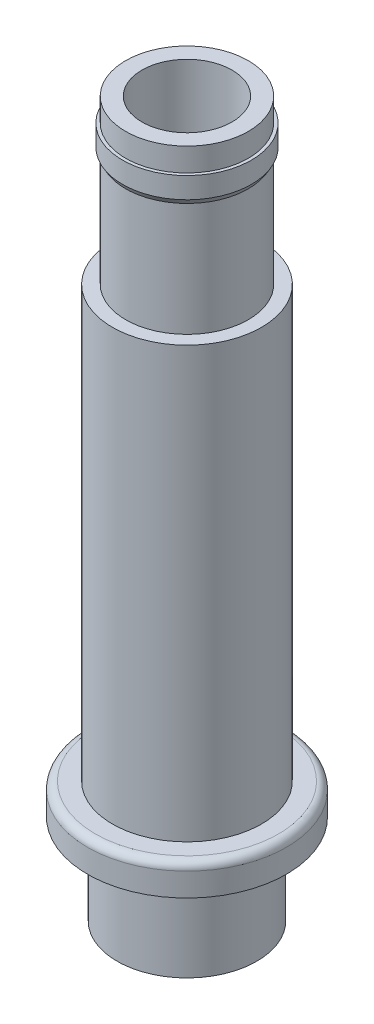
ISO-10303-21;
HEADER;
FILE_DESCRIPTION(('STEP AP214'),'2;1');
FILE_NAME('part.step','',(''),(''),'','','');
FILE_SCHEMA(('AUTOMOTIVE_DESIGN { 1 0 10303 214 1 1 1 1 }'));
ENDSEC;
DATA;
#1=APPLICATION_CONTEXT('core data for automotive mechanical design processes');
#2=APPLICATION_PROTOCOL_DEFINITION('international standard','automotive_design',2000,#1);
#3=PRODUCT_CONTEXT('',#1,'mechanical');
#4=PRODUCT('Part','Part','',(#3));
#5=PRODUCT_RELATED_PRODUCT_CATEGORY('part','',(#4));
#6=PRODUCT_DEFINITION_FORMATION('','',#4);
#7=PRODUCT_DEFINITION_CONTEXT('part definition',#1,'design');
#8=PRODUCT_DEFINITION('design','',#6,#7);
#9=PRODUCT_DEFINITION_SHAPE('','',#8);
#10=(LENGTH_UNIT() NAMED_UNIT(*) SI_UNIT(.MILLI.,.METRE.));
#11=(NAMED_UNIT(*) PLANE_ANGLE_UNIT() SI_UNIT($,.RADIAN.));
#12=(NAMED_UNIT(*) SI_UNIT($,.STERADIAN.) SOLID_ANGLE_UNIT());
#13=UNCERTAINTY_MEASURE_WITH_UNIT(LENGTH_MEASURE(1.E-05),#10,'distance_accuracy_value','');
#14=(GEOMETRIC_REPRESENTATION_CONTEXT(3) GLOBAL_UNCERTAINTY_ASSIGNED_CONTEXT((#13)) GLOBAL_UNIT_ASSIGNED_CONTEXT((#10,
#11,#12)) REPRESENTATION_CONTEXT('',''));
#15=CARTESIAN_POINT('',(0.,0.,0.));
#16=DIRECTION('',(0.,0.,1.));
#17=DIRECTION('',(1.,0.,0.));
#18=AXIS2_PLACEMENT_3D('',#15,#16,#17);
#19=CARTESIAN_POINT('',(0.,0.,0.));
#20=DIRECTION('',(0.,-1.,0.));
#21=DIRECTION('',(0.,0.,-1.));
#22=AXIS2_PLACEMENT_3D('',#19,#20,#21);
#23=CYLINDRICAL_SURFACE('',#22,3.15);
#24=CARTESIAN_POINT('',(0.,6.8,0.));
#25=DIRECTION('',(0.,-1.,0.));
#26=DIRECTION('',(0.,0.,-1.));
#27=AXIS2_PLACEMENT_3D('',#24,#25,#26);
#28=CIRCLE('',#27,3.15);
#29=CARTESIAN_POINT('',(0.,6.8,-3.15));
#30=VERTEX_POINT('',#29);
#31=EDGE_CURVE('E185',#30,#30,#28,.T.);
#32=ORIENTED_EDGE('',*,*,#31,.T.);
#33=EDGE_LOOP('',(#32));
#34=FACE_BOUND('',#33,.T.);
#35=CARTESIAN_POINT('',(0.,33.,0.));
#36=DIRECTION('',(0.,-1.,0.));
#37=DIRECTION('',(0.,0.,-1.));
#38=AXIS2_PLACEMENT_3D('',#35,#36,#37);
#39=CIRCLE('',#38,3.15);
#40=CARTESIAN_POINT('',(3.1304951684997,33.,0.350000000000033));
#41=VERTEX_POINT('',#40);
#42=CARTESIAN_POINT('',(0.35,33.,3.13049516849971));
#43=VERTEX_POINT('',#42);
#44=EDGE_CURVE('E166',#41,#43,#39,.T.);
#45=ORIENTED_EDGE('',*,*,#44,.F.);
#46=DIRECTION('',(0.,-1.,0.));
#47=VECTOR('',#46,1.);
#48=CARTESIAN_POINT('',(3.1304951684997,0.,0.350000000000033));
#49=LINE('',#48,#47);
#50=CARTESIAN_POINT('',(3.1304951684997,14.,0.350000000000033));
#51=VERTEX_POINT('',#50);
#52=EDGE_CURVE('E150',#51,#41,#49,.F.);
#53=ORIENTED_EDGE('',*,*,#52,.F.);
#54=CARTESIAN_POINT('',(0.,14.,0.));
#55=DIRECTION('',(0.,1.,0.));
#56=DIRECTION('',(0.,0.,1.));
#57=AXIS2_PLACEMENT_3D('',#54,#55,#56);
#58=CIRCLE('',#57,3.15);
#59=CARTESIAN_POINT('',(3.13049516849971,14.,-0.349999999999967));
#60=VERTEX_POINT('',#59);
#61=EDGE_CURVE('E160',#60,#51,#58,.F.);
#62=ORIENTED_EDGE('',*,*,#61,.F.);
#63=DIRECTION('',(0.,-1.,0.));
#64=VECTOR('',#63,1.);
#65=CARTESIAN_POINT('',(3.13049516849971,0.,-0.349999999999967));
#66=LINE('',#65,#64);
#67=CARTESIAN_POINT('',(3.13049516849971,33.,-0.349999999999967));
#68=VERTEX_POINT('',#67);
#69=EDGE_CURVE('E775',#68,#60,#66,.T.);
#70=ORIENTED_EDGE('',*,*,#69,.F.);
#71=CARTESIAN_POINT('',(0.35,33.,-3.13049516849971));
#72=VERTEX_POINT('',#71);
#73=EDGE_CURVE('E174',#72,#68,#39,.T.);
#74=ORIENTED_EDGE('',*,*,#73,.F.);
#75=DIRECTION('',(0.,-1.,0.));
#76=VECTOR('',#75,1.);
#77=CARTESIAN_POINT('',(0.35,0.,-3.13049516849971));
#78=LINE('',#77,#76);
#79=CARTESIAN_POINT('',(0.35,14.,-3.13049516849971));
#80=VERTEX_POINT('',#79);
#81=EDGE_CURVE('E215',#80,#72,#78,.F.);
#82=ORIENTED_EDGE('',*,*,#81,.F.);
#83=CARTESIAN_POINT('',(0.,14.,0.));
#84=DIRECTION('',(0.,1.,0.));
#85=DIRECTION('',(0.,0.,1.));
#86=AXIS2_PLACEMENT_3D('',#83,#84,#85);
#87=CIRCLE('',#86,3.15);
#88=CARTESIAN_POINT('',(-0.35,14.,-3.13049516849971));
#89=VERTEX_POINT('',#88);
#90=EDGE_CURVE('E205',#89,#80,#87,.F.);
#91=ORIENTED_EDGE('',*,*,#90,.F.);
#92=DIRECTION('',(0.,-1.,0.));
#93=VECTOR('',#92,1.);
#94=CARTESIAN_POINT('',(-0.35,0.,-3.13049516849971));
#95=LINE('',#94,#93);
#96=CARTESIAN_POINT('',(-0.35,33.,-3.13049516849971));
#97=VERTEX_POINT('',#96);
#98=EDGE_CURVE('E203',#97,#89,#95,.T.);
#99=ORIENTED_EDGE('',*,*,#98,.F.);
#100=CARTESIAN_POINT('',(-3.1304951684997,33.,-0.350000000000011));
#101=VERTEX_POINT('',#100);
#102=EDGE_CURVE('E179',#101,#97,#39,.T.);
#103=ORIENTED_EDGE('',*,*,#102,.F.);
#104=DIRECTION('',(0.,-1.,0.));
#105=VECTOR('',#104,1.);
#106=CARTESIAN_POINT('',(-3.1304951684997,0.,-0.350000000000011));
#107=LINE('',#106,#105);
#108=CARTESIAN_POINT('',(-3.1304951684997,14.,-0.350000000000011));
#109=VERTEX_POINT('',#108);
#110=EDGE_CURVE('E201',#109,#101,#107,.F.);
#111=ORIENTED_EDGE('',*,*,#110,.F.);
#112=CARTESIAN_POINT('',(0.,14.,0.));
#113=DIRECTION('',(0.,1.,0.));
#114=DIRECTION('',(0.,0.,1.));
#115=AXIS2_PLACEMENT_3D('',#112,#113,#114);
#116=CIRCLE('',#115,3.15);
#117=CARTESIAN_POINT('',(-3.13049516849971,14.,0.349999999999989));
#118=VERTEX_POINT('',#117);
#119=EDGE_CURVE('E238',#118,#109,#116,.F.);
#120=ORIENTED_EDGE('',*,*,#119,.F.);
#121=DIRECTION('',(0.,-1.,0.));
#122=VECTOR('',#121,1.);
#123=CARTESIAN_POINT('',(-3.13049516849971,0.,0.349999999999989));
#124=LINE('',#123,#122);
#125=CARTESIAN_POINT('',(-3.13049516849971,33.,0.349999999999989));
#126=VERTEX_POINT('',#125);
#127=EDGE_CURVE('E231',#126,#118,#124,.T.);
#128=ORIENTED_EDGE('',*,*,#127,.F.);
#129=CARTESIAN_POINT('',(-0.35,33.,3.13049516849971));
#130=VERTEX_POINT('',#129);
#131=EDGE_CURVE('E177',#130,#126,#39,.T.);
#132=ORIENTED_EDGE('',*,*,#131,.F.);
#133=DIRECTION('',(0.,-1.,0.));
#134=VECTOR('',#133,1.);
#135=CARTESIAN_POINT('',(-0.35,0.,3.13049516849971));
#136=LINE('',#135,#134);
#137=CARTESIAN_POINT('',(-0.35,14.,3.13049516849971));
#138=VERTEX_POINT('',#137);
#139=EDGE_CURVE('E259',#138,#130,#136,.F.);
#140=ORIENTED_EDGE('',*,*,#139,.F.);
#141=CARTESIAN_POINT('',(0.,14.,0.));
#142=DIRECTION('',(0.,1.,0.));
#143=DIRECTION('',(0.,0.,1.));
#144=AXIS2_PLACEMENT_3D('',#141,#142,#143);
#145=CIRCLE('',#144,3.15);
#146=CARTESIAN_POINT('',(0.35,14.,3.13049516849971));
#147=VERTEX_POINT('',#146);
#148=EDGE_CURVE('E262',#147,#138,#145,.F.);
#149=ORIENTED_EDGE('',*,*,#148,.F.);
#150=DIRECTION('',(0.,-1.,0.));
#151=VECTOR('',#150,1.);
#152=CARTESIAN_POINT('',(0.35,0.,3.13049516849971));
#153=LINE('',#152,#151);
#154=EDGE_CURVE('E173',#43,#147,#153,.T.);
#155=ORIENTED_EDGE('',*,*,#154,.F.);
#156=EDGE_LOOP('',(#45,#53,#62,#70,#74,#82,#91,#99,#103,#111,#120,#128,#132,#140,#149,#155));
#157=FACE_BOUND('',#156,.T.);
#158=ADVANCED_FACE('F37',(#34,#157),#23,.F.);
#159=CARTESIAN_POINT('',(0.,33.,-1.75));
#160=DIRECTION('',(0.,-1.,0.));
#161=DIRECTION('',(0.,0.,-1.));
#162=AXIS2_PLACEMENT_3D('',#159,#160,#161);
#163=PLANE('',#162);
#164=CARTESIAN_POINT('',(0.,33.,0.));
#165=DIRECTION('',(0.,-1.,0.));
#166=DIRECTION('',(0.,0.,-1.));
#167=AXIS2_PLACEMENT_3D('',#164,#165,#166);
#168=CIRCLE('',#167,1.75);
#169=CARTESIAN_POINT('',(0.,33.,-1.75));
#170=VERTEX_POINT('',#169);
#171=EDGE_CURVE('E175',#170,#170,#168,.T.);
#172=ORIENTED_EDGE('',*,*,#171,.F.);
#173=EDGE_LOOP('',(#172));
#174=FACE_BOUND('',#173,.T.);
#175=DIRECTION('',(0.,0.,-1.));
#176=VECTOR('',#175,1.);
#177=CARTESIAN_POINT('',(2.15,33.,-0.349999999999977));
#178=LINE('',#177,#176);
#179=CARTESIAN_POINT('',(2.15,33.,0.350000000000023));
#180=VERTEX_POINT('',#179);
#181=CARTESIAN_POINT('',(2.15,33.,-0.349999999999977));
#182=VERTEX_POINT('',#181);
#183=EDGE_CURVE('E169',#180,#182,#178,.T.);
#184=ORIENTED_EDGE('',*,*,#183,.F.);
#185=DIRECTION('',(-1.,0.,0.));
#186=VECTOR('',#185,1.);
#187=CARTESIAN_POINT('',(3.15,33.,0.350000000000033));
#188=LINE('',#187,#186);
#189=EDGE_CURVE('E153',#41,#180,#188,.T.);
#190=ORIENTED_EDGE('',*,*,#189,.F.);
#191=ORIENTED_EDGE('',*,*,#44,.T.);
#192=DIRECTION('',(0.,0.,1.));
#193=VECTOR('',#192,1.);
#194=CARTESIAN_POINT('',(0.35,33.,3.15));
#195=LINE('',#194,#193);
#196=CARTESIAN_POINT('',(0.35,33.,2.15));
#197=VERTEX_POINT('',#196);
#198=EDGE_CURVE('E253',#197,#43,#195,.T.);
#199=ORIENTED_EDGE('',*,*,#198,.F.);
#200=DIRECTION('',(1.,0.,0.));
#201=VECTOR('',#200,1.);
#202=CARTESIAN_POINT('',(0.35,33.,2.15));
#203=LINE('',#202,#201);
#204=CARTESIAN_POINT('',(-0.35,33.,2.15));
#205=VERTEX_POINT('',#204);
#206=EDGE_CURVE('E255',#205,#197,#203,.T.);
#207=ORIENTED_EDGE('',*,*,#206,.F.);
#208=DIRECTION('',(0.,0.,-1.));
#209=VECTOR('',#208,1.);
#210=CARTESIAN_POINT('',(-0.35,33.,3.15));
#211=LINE('',#210,#209);
#212=EDGE_CURVE('E257',#130,#205,#211,.T.);
#213=ORIENTED_EDGE('',*,*,#212,.F.);
#214=ORIENTED_EDGE('',*,*,#131,.T.);
#215=DIRECTION('',(-1.,0.,0.));
#216=VECTOR('',#215,1.);
#217=CARTESIAN_POINT('',(-3.15,33.,0.349999999999989));
#218=LINE('',#217,#216);
#219=CARTESIAN_POINT('',(-2.15,33.,0.349999999999992));
#220=VERTEX_POINT('',#219);
#221=EDGE_CURVE('E229',#220,#126,#218,.T.);
#222=ORIENTED_EDGE('',*,*,#221,.F.);
#223=DIRECTION('',(0.,0.,1.));
#224=VECTOR('',#223,1.);
#225=CARTESIAN_POINT('',(-2.15,33.,0.349999999999993));
#226=LINE('',#225,#224);
#227=CARTESIAN_POINT('',(-2.15,33.,-0.350000000000007));
#228=VERTEX_POINT('',#227);
#229=EDGE_CURVE('E232',#228,#220,#226,.T.);
#230=ORIENTED_EDGE('',*,*,#229,.F.);
#231=DIRECTION('',(1.,0.,0.));
#232=VECTOR('',#231,1.);
#233=CARTESIAN_POINT('',(-3.15,33.,-0.350000000000011));
#234=LINE('',#233,#232);
#235=EDGE_CURVE('E197',#101,#228,#234,.T.);
#236=ORIENTED_EDGE('',*,*,#235,.F.);
#237=ORIENTED_EDGE('',*,*,#102,.T.);
#238=DIRECTION('',(0.,0.,-1.));
#239=VECTOR('',#238,1.);
#240=CARTESIAN_POINT('',(-0.35,33.,-3.15));
#241=LINE('',#240,#239);
#242=CARTESIAN_POINT('',(-0.35,33.,-2.15));
#243=VERTEX_POINT('',#242);
#244=EDGE_CURVE('E195',#243,#97,#241,.T.);
#245=ORIENTED_EDGE('',*,*,#244,.F.);
#246=DIRECTION('',(-1.,0.,0.));
#247=VECTOR('',#246,1.);
#248=CARTESIAN_POINT('',(-0.35,33.,-2.15));
#249=LINE('',#248,#247);
#250=CARTESIAN_POINT('',(0.35,33.,-2.15));
#251=VERTEX_POINT('',#250);
#252=EDGE_CURVE('E207',#251,#243,#249,.T.);
#253=ORIENTED_EDGE('',*,*,#252,.F.);
#254=DIRECTION('',(0.,0.,1.));
#255=VECTOR('',#254,1.);
#256=CARTESIAN_POINT('',(0.35,33.,-3.15));
#257=LINE('',#256,#255);
#258=EDGE_CURVE('E209',#72,#251,#257,.T.);
#259=ORIENTED_EDGE('',*,*,#258,.F.);
#260=ORIENTED_EDGE('',*,*,#73,.T.);
#261=DIRECTION('',(1.,0.,0.));
#262=VECTOR('',#261,1.);
#263=CARTESIAN_POINT('',(3.15,33.,-0.349999999999967));
#264=LINE('',#263,#262);
#265=EDGE_CURVE('E784',#182,#68,#264,.T.);
#266=ORIENTED_EDGE('',*,*,#265,.F.);
#267=EDGE_LOOP('',(#184,#190,#191,#199,#207,#213,#214,#222,#230,#236,#237,#245,#253,#259,#260,#266));
#268=FACE_BOUND('',#267,.T.);
#269=ADVANCED_FACE('F164',(#174,#268),#163,.T.);
#270=CARTESIAN_POINT('',(0.,6.8,-3.15));
#271=DIRECTION('',(0.,-1.,0.));
#272=DIRECTION('',(0.,0.,-1.));
#273=AXIS2_PLACEMENT_3D('',#270,#271,#272);
#274=PLANE('',#273);
#275=CARTESIAN_POINT('',(0.,6.8,0.));
#276=DIRECTION('',(0.,-1.,0.));
#277=DIRECTION('',(0.,0.,-1.));
#278=AXIS2_PLACEMENT_3D('',#275,#276,#277);
#279=CIRCLE('',#278,3.5);
#280=CARTESIAN_POINT('',(0.,6.8,-3.5));
#281=VERTEX_POINT('',#280);
#282=EDGE_CURVE('E277',#281,#281,#279,.T.);
#283=ORIENTED_EDGE('',*,*,#282,.T.);
#284=EDGE_LOOP('',(#283));
#285=FACE_BOUND('',#284,.T.);
#286=ORIENTED_EDGE('',*,*,#31,.F.);
#287=EDGE_LOOP('',(#286));
#288=FACE_BOUND('',#287,.T.);
#289=ADVANCED_FACE('F336',(#285,#288),#274,.T.);
#290=CARTESIAN_POINT('',(0.,0.,0.));
#291=DIRECTION('',(0.,-1.,0.));
#292=DIRECTION('',(0.,0.,-1.));
#293=AXIS2_PLACEMENT_3D('',#290,#291,#292);
#294=CYLINDRICAL_SURFACE('',#293,1.75);
#295=ORIENTED_EDGE('',*,*,#171,.T.);
#296=EDGE_LOOP('',(#295));
#297=FACE_BOUND('',#296,.T.);
#298=CARTESIAN_POINT('',(0.,34.,0.));
#299=DIRECTION('',(0.,-1.,0.));
#300=DIRECTION('',(0.,0.,-1.));
#301=AXIS2_PLACEMENT_3D('',#298,#299,#300);
#302=CIRCLE('',#301,1.75);
#303=CARTESIAN_POINT('',(0.,34.,-1.75));
#304=VERTEX_POINT('',#303);
#305=EDGE_CURVE('E181',#304,#304,#302,.T.);
#306=ORIENTED_EDGE('',*,*,#305,.F.);
#307=EDGE_LOOP('',(#306));
#308=FACE_BOUND('',#307,.T.);
#309=ADVANCED_FACE('F334',(#297,#308),#294,.F.);
#310=CARTESIAN_POINT('',(0.,37.5,0.));
#311=DIRECTION('',(0.,1.,0.));
#312=DIRECTION('',(0.,0.,1.));
#313=AXIS2_PLACEMENT_3D('',#310,#311,#312);
#314=CONICAL_SURFACE('',#313,2.9,0.317458735254631);
#315=ORIENTED_EDGE('',*,*,#305,.T.);
#316=EDGE_LOOP('',(#315));
#317=FACE_BOUND('',#316,.T.);
#318=CARTESIAN_POINT('',(0.,37.5,0.));
#319=DIRECTION('',(0.,-1.,0.));
#320=DIRECTION('',(0.,0.,-1.));
#321=AXIS2_PLACEMENT_3D('',#318,#319,#320);
#322=CIRCLE('',#321,2.9);
#323=CARTESIAN_POINT('',(0.,37.5,-2.9));
#324=VERTEX_POINT('',#323);
#325=EDGE_CURVE('E325',#324,#324,#322,.T.);
#326=ORIENTED_EDGE('',*,*,#325,.F.);
#327=EDGE_LOOP('',(#326));
#328=FACE_BOUND('',#327,.T.);
#329=ADVANCED_FACE('F331',(#317,#328),#314,.F.);
#330=CARTESIAN_POINT('',(0.,0.,0.));
#331=DIRECTION('',(0.,-1.,0.));
#332=DIRECTION('',(0.,0.,-1.));
#333=AXIS2_PLACEMENT_3D('',#330,#331,#332);
#334=CYLINDRICAL_SURFACE('',#333,2.9);
#335=ORIENTED_EDGE('',*,*,#325,.T.);
#336=EDGE_LOOP('',(#335));
#337=FACE_BOUND('',#336,.T.);
#338=CARTESIAN_POINT('',(0.,46.,0.));
#339=DIRECTION('',(0.,-1.,0.));
#340=DIRECTION('',(0.,0.,-1.));
#341=AXIS2_PLACEMENT_3D('',#338,#339,#340);
#342=CIRCLE('',#341,2.9);
#343=CARTESIAN_POINT('',(0.,46.,-2.9));
#344=VERTEX_POINT('',#343);
#345=EDGE_CURVE('E322',#344,#344,#342,.T.);
#346=ORIENTED_EDGE('',*,*,#345,.F.);
#347=EDGE_LOOP('',(#346));
#348=FACE_BOUND('',#347,.T.);
#349=ADVANCED_FACE('F343',(#337,#348),#334,.F.);
#350=CARTESIAN_POINT('',(0.,46.,-3.95));
#351=DIRECTION('',(0.,1.,0.));
#352=DIRECTION('',(0.,0.,1.));
#353=AXIS2_PLACEMENT_3D('',#350,#351,#352);
#354=PLANE('',#353);
#355=ORIENTED_EDGE('',*,*,#345,.T.);
#356=EDGE_LOOP('',(#355));
#357=FACE_BOUND('',#356,.T.);
#358=CARTESIAN_POINT('',(0.,46.,0.));
#359=DIRECTION('',(0.,-1.,0.));
#360=DIRECTION('',(0.,0.,-1.));
#361=AXIS2_PLACEMENT_3D('',#358,#359,#360);
#362=CIRCLE('',#361,3.95);
#363=CARTESIAN_POINT('',(0.,46.,-3.95));
#364=VERTEX_POINT('',#363);
#365=EDGE_CURVE('E319',#364,#364,#362,.T.);
#366=ORIENTED_EDGE('',*,*,#365,.F.);
#367=EDGE_LOOP('',(#366));
#368=FACE_BOUND('',#367,.T.);
#369=ADVANCED_FACE('F386',(#357,#368),#354,.T.);
#370=CARTESIAN_POINT('',(0.,0.,0.));
#371=DIRECTION('',(0.,-1.,0.));
#372=DIRECTION('',(0.,0.,-1.));
#373=AXIS2_PLACEMENT_3D('',#370,#371,#372);
#374=CYLINDRICAL_SURFACE('',#373,3.95);
#375=ORIENTED_EDGE('',*,*,#365,.T.);
#376=EDGE_LOOP('',(#375));
#377=FACE_BOUND('',#376,.T.);
#378=CARTESIAN_POINT('',(0.,44.5,0.));
#379=DIRECTION('',(0.,-1.,0.));
#380=DIRECTION('',(0.,0.,-1.));
#381=AXIS2_PLACEMENT_3D('',#378,#379,#380);
#382=CIRCLE('',#381,3.95);
#383=CARTESIAN_POINT('',(0.,44.5,-3.95));
#384=VERTEX_POINT('',#383);
#385=EDGE_CURVE('E316',#384,#384,#382,.T.);
#386=ORIENTED_EDGE('',*,*,#385,.F.);
#387=EDGE_LOOP('',(#386));
#388=FACE_BOUND('',#387,.T.);
#389=ADVANCED_FACE('F397',(#377,#388),#374,.T.);
#390=CARTESIAN_POINT('',(0.,44.5,-4.15));
#391=DIRECTION('',(0.,1.,0.));
#392=DIRECTION('',(0.,0.,1.));
#393=AXIS2_PLACEMENT_3D('',#390,#391,#392);
#394=PLANE('',#393);
#395=ORIENTED_EDGE('',*,*,#385,.T.);
#396=EDGE_LOOP('',(#395));
#397=FACE_BOUND('',#396,.T.);
#398=CARTESIAN_POINT('',(0.,44.5,0.));
#399=DIRECTION('',(0.,-1.,0.));
#400=DIRECTION('',(0.,0.,-1.));
#401=AXIS2_PLACEMENT_3D('',#398,#399,#400);
#402=CIRCLE('',#401,4.15);
#403=CARTESIAN_POINT('',(0.,44.5,-4.15));
#404=VERTEX_POINT('',#403);
#405=EDGE_CURVE('E313',#404,#404,#402,.T.);
#406=ORIENTED_EDGE('',*,*,#405,.F.);
#407=EDGE_LOOP('',(#406));
#408=FACE_BOUND('',#407,.T.);
#409=ADVANCED_FACE('F408',(#397,#408),#394,.T.);
#410=CARTESIAN_POINT('',(0.,0.,0.));
#411=DIRECTION('',(0.,-1.,0.));
#412=DIRECTION('',(0.,0.,-1.));
#413=AXIS2_PLACEMENT_3D('',#410,#411,#412);
#414=CYLINDRICAL_SURFACE('',#413,4.15);
#415=ORIENTED_EDGE('',*,*,#405,.T.);
#416=EDGE_LOOP('',(#415));
#417=FACE_BOUND('',#416,.T.);
#418=CARTESIAN_POINT('',(0.,43.1464101615138,0.));
#419=DIRECTION('',(0.,-1.,0.));
#420=DIRECTION('',(0.,0.,-1.));
#421=AXIS2_PLACEMENT_3D('',#418,#419,#420);
#422=CIRCLE('',#421,4.15);
#423=CARTESIAN_POINT('',(0.,43.1464101615138,-4.15));
#424=VERTEX_POINT('',#423);
#425=EDGE_CURVE('E310',#424,#424,#422,.T.);
#426=ORIENTED_EDGE('',*,*,#425,.F.);
#427=EDGE_LOOP('',(#426));
#428=FACE_BOUND('',#427,.T.);
#429=ADVANCED_FACE('F419',(#417,#428),#414,.T.);
#430=CARTESIAN_POINT('',(0.,42.8,0.));
#431=DIRECTION('',(0.,1.,0.));
#432=DIRECTION('',(0.,0.,1.));
#433=AXIS2_PLACEMENT_3D('',#430,#431,#432);
#434=CONICAL_SURFACE('',#433,3.95,0.523598775598317);
#435=ORIENTED_EDGE('',*,*,#425,.T.);
#436=EDGE_LOOP('',(#435));
#437=FACE_BOUND('',#436,.T.);
#438=CARTESIAN_POINT('',(0.,42.8,0.));
#439=DIRECTION('',(0.,-1.,0.));
#440=DIRECTION('',(0.,0.,-1.));
#441=AXIS2_PLACEMENT_3D('',#438,#439,#440);
#442=CIRCLE('',#441,3.95);
#443=CARTESIAN_POINT('',(0.,42.8,-3.95));
#444=VERTEX_POINT('',#443);
#445=EDGE_CURVE('E307',#444,#444,#442,.T.);
#446=ORIENTED_EDGE('',*,*,#445,.F.);
#447=EDGE_LOOP('',(#446));
#448=FACE_BOUND('',#447,.T.);
#449=ADVANCED_FACE('F430',(#437,#448),#434,.T.);
#450=CARTESIAN_POINT('',(0.,0.,0.));
#451=DIRECTION('',(0.,-1.,0.));
#452=DIRECTION('',(0.,0.,-1.));
#453=AXIS2_PLACEMENT_3D('',#450,#451,#452);
#454=CYLINDRICAL_SURFACE('',#453,3.95);
#455=ORIENTED_EDGE('',*,*,#445,.T.);
#456=EDGE_LOOP('',(#455));
#457=FACE_BOUND('',#456,.T.);
#458=CARTESIAN_POINT('',(0.,35.5,0.));
#459=DIRECTION('',(0.,-1.,0.));
#460=DIRECTION('',(0.,0.,-1.));
#461=AXIS2_PLACEMENT_3D('',#458,#459,#460);
#462=CIRCLE('',#461,3.95);
#463=CARTESIAN_POINT('',(0.,35.5,-3.95));
#464=VERTEX_POINT('',#463);
#465=EDGE_CURVE('E304',#464,#464,#462,.T.);
#466=ORIENTED_EDGE('',*,*,#465,.F.);
#467=EDGE_LOOP('',(#466));
#468=FACE_BOUND('',#467,.T.);
#469=ADVANCED_FACE('F441',(#457,#468),#454,.T.);
#470=CARTESIAN_POINT('',(0.,35.5,-4.8));
#471=DIRECTION('',(0.,1.,0.));
#472=DIRECTION('',(0.,0.,1.));
#473=AXIS2_PLACEMENT_3D('',#470,#471,#472);
#474=PLANE('',#473);
#475=ORIENTED_EDGE('',*,*,#465,.T.);
#476=EDGE_LOOP('',(#475));
#477=FACE_BOUND('',#476,.T.);
#478=CARTESIAN_POINT('',(0.,35.5,0.));
#479=DIRECTION('',(0.,-1.,0.));
#480=DIRECTION('',(0.,0.,-1.));
#481=AXIS2_PLACEMENT_3D('',#478,#479,#480);
#482=CIRCLE('',#481,4.8);
#483=CARTESIAN_POINT('',(0.,35.5,-4.8));
#484=VERTEX_POINT('',#483);
#485=EDGE_CURVE('E301',#484,#484,#482,.T.);
#486=ORIENTED_EDGE('',*,*,#485,.F.);
#487=EDGE_LOOP('',(#486));
#488=FACE_BOUND('',#487,.T.);
#489=ADVANCED_FACE('F452',(#477,#488),#474,.T.);
#490=CARTESIAN_POINT('',(0.,0.,0.));
#491=DIRECTION('',(0.,-1.,0.));
#492=DIRECTION('',(0.,0.,-1.));
#493=AXIS2_PLACEMENT_3D('',#490,#491,#492);
#494=CYLINDRICAL_SURFACE('',#493,4.8);
#495=ORIENTED_EDGE('',*,*,#485,.T.);
#496=EDGE_LOOP('',(#495));
#497=FACE_BOUND('',#496,.T.);
#498=CARTESIAN_POINT('',(0.,7.8,0.));
#499=DIRECTION('',(0.,-1.,0.));
#500=DIRECTION('',(0.,0.,-1.));
#501=AXIS2_PLACEMENT_3D('',#498,#499,#500);
#502=CIRCLE('',#501,4.8);
#503=CARTESIAN_POINT('',(0.,7.8,-4.8));
#504=VERTEX_POINT('',#503);
#505=EDGE_CURVE('E298',#504,#504,#502,.T.);
#506=ORIENTED_EDGE('',*,*,#505,.F.);
#507=EDGE_LOOP('',(#506));
#508=FACE_BOUND('',#507,.T.);
#509=ADVANCED_FACE('F463',(#497,#508),#494,.T.);
#510=CARTESIAN_POINT('',(0.,7.8,-6.4));
#511=DIRECTION('',(0.,1.,0.));
#512=DIRECTION('',(0.,0.,1.));
#513=AXIS2_PLACEMENT_3D('',#510,#511,#512);
#514=PLANE('',#513);
#515=CARTESIAN_POINT('',(0.,7.8,0.));
#516=DIRECTION('',(0.,1.,0.));
#517=DIRECTION('',(0.,0.,1.));
#518=AXIS2_PLACEMENT_3D('',#515,#516,#517);
#519=CIRCLE('',#518,5.9);
#520=CARTESIAN_POINT('',(0.,7.8,5.9));
#521=VERTEX_POINT('',#520);
#522=EDGE_CURVE('E11',#521,#521,#519,.T.);
#523=ORIENTED_EDGE('',*,*,#522,.T.);
#524=EDGE_LOOP('',(#523));
#525=FACE_BOUND('',#524,.T.);
#526=ORIENTED_EDGE('',*,*,#505,.T.);
#527=EDGE_LOOP('',(#526));
#528=FACE_BOUND('',#527,.T.);
#529=ADVANCED_FACE('F474',(#525,#528),#514,.T.);
#530=CARTESIAN_POINT('',(0.,0.,0.));
#531=DIRECTION('',(0.,-1.,0.));
#532=DIRECTION('',(0.,0.,-1.));
#533=AXIS2_PLACEMENT_3D('',#530,#531,#532);
#534=CYLINDRICAL_SURFACE('',#533,6.4);
#535=CARTESIAN_POINT('',(0.,7.3,0.));
#536=DIRECTION('',(0.,1.,0.));
#537=DIRECTION('',(0.,0.,1.));
#538=AXIS2_PLACEMENT_3D('',#535,#536,#537);
#539=CIRCLE('',#538,6.4);
#540=CARTESIAN_POINT('',(0.,7.3,6.4));
#541=VERTEX_POINT('',#540);
#542=EDGE_CURVE('E45',#541,#541,#539,.F.);
#543=ORIENTED_EDGE('',*,*,#542,.T.);
#544=EDGE_LOOP('',(#543));
#545=FACE_BOUND('',#544,.T.);
#546=CARTESIAN_POINT('',(0.,5.8,0.));
#547=DIRECTION('',(0.,-1.,0.));
#548=DIRECTION('',(0.,0.,-1.));
#549=AXIS2_PLACEMENT_3D('',#546,#547,#548);
#550=CIRCLE('',#549,6.4);
#551=CARTESIAN_POINT('',(0.,5.8,-6.4));
#552=VERTEX_POINT('',#551);
#553=EDGE_CURVE('E295',#552,#552,#550,.T.);
#554=ORIENTED_EDGE('',*,*,#553,.F.);
#555=EDGE_LOOP('',(#554));
#556=FACE_BOUND('',#555,.T.);
#557=ADVANCED_FACE('F489',(#545,#556),#534,.T.);
#558=CARTESIAN_POINT('',(0.,5.8,-5.4));
#559=DIRECTION('',(0.,-1.,0.));
#560=DIRECTION('',(0.,0.,-1.));
#561=AXIS2_PLACEMENT_3D('',#558,#559,#560);
#562=PLANE('',#561);
#563=ORIENTED_EDGE('',*,*,#553,.T.);
#564=EDGE_LOOP('',(#563));
#565=FACE_BOUND('',#564,.T.);
#566=CARTESIAN_POINT('',(0.,5.8,0.));
#567=DIRECTION('',(0.,-1.,0.));
#568=DIRECTION('',(0.,0.,-1.));
#569=AXIS2_PLACEMENT_3D('',#566,#567,#568);
#570=CIRCLE('',#569,5.4);
#571=CARTESIAN_POINT('',(0.,5.8,-5.4));
#572=VERTEX_POINT('',#571);
#573=EDGE_CURVE('E292',#572,#572,#570,.T.);
#574=ORIENTED_EDGE('',*,*,#573,.F.);
#575=EDGE_LOOP('',(#574));
#576=FACE_BOUND('',#575,.T.);
#577=ADVANCED_FACE('F483',(#565,#576),#562,.T.);
#578=CARTESIAN_POINT('',(0.,0.,0.));
#579=DIRECTION('',(0.,-1.,0.));
#580=DIRECTION('',(0.,0.,-1.));
#581=AXIS2_PLACEMENT_3D('',#578,#579,#580);
#582=CYLINDRICAL_SURFACE('',#581,5.4);
#583=ORIENTED_EDGE('',*,*,#573,.T.);
#584=EDGE_LOOP('',(#583));
#585=FACE_BOUND('',#584,.T.);
#586=CARTESIAN_POINT('',(0.,6.8,0.));
#587=DIRECTION('',(0.,-1.,0.));
#588=DIRECTION('',(0.,0.,-1.));
#589=AXIS2_PLACEMENT_3D('',#586,#587,#588);
#590=CIRCLE('',#589,5.4);
#591=CARTESIAN_POINT('',(0.,6.8,-5.4));
#592=VERTEX_POINT('',#591);
#593=EDGE_CURVE('E289',#592,#592,#590,.T.);
#594=ORIENTED_EDGE('',*,*,#593,.F.);
#595=EDGE_LOOP('',(#594));
#596=FACE_BOUND('',#595,.T.);
#597=ADVANCED_FACE('F488',(#585,#596),#582,.F.);
#598=CARTESIAN_POINT('',(0.,6.8,-4.5));
#599=DIRECTION('',(0.,-1.,0.));
#600=DIRECTION('',(0.,0.,-1.));
#601=AXIS2_PLACEMENT_3D('',#598,#599,#600);
#602=PLANE('',#601);
#603=ORIENTED_EDGE('',*,*,#593,.T.);
#604=EDGE_LOOP('',(#603));
#605=FACE_BOUND('',#604,.T.);
#606=CARTESIAN_POINT('',(0.,6.8,0.));
#607=DIRECTION('',(0.,-1.,0.));
#608=DIRECTION('',(0.,0.,-1.));
#609=AXIS2_PLACEMENT_3D('',#606,#607,#608);
#610=CIRCLE('',#609,4.5);
#611=CARTESIAN_POINT('',(0.,6.8,-4.5));
#612=VERTEX_POINT('',#611);
#613=EDGE_CURVE('E286',#612,#612,#610,.T.);
#614=ORIENTED_EDGE('',*,*,#613,.F.);
#615=EDGE_LOOP('',(#614));
#616=FACE_BOUND('',#615,.T.);
#617=ADVANCED_FACE('F502',(#605,#616),#602,.T.);
#618=CARTESIAN_POINT('',(0.,0.,0.));
#619=DIRECTION('',(0.,-1.,0.));
#620=DIRECTION('',(0.,0.,-1.));
#621=AXIS2_PLACEMENT_3D('',#618,#619,#620);
#622=CYLINDRICAL_SURFACE('',#621,4.5);
#623=ORIENTED_EDGE('',*,*,#613,.T.);
#624=EDGE_LOOP('',(#623));
#625=FACE_BOUND('',#624,.T.);
#626=CARTESIAN_POINT('',(0.,0.,0.));
#627=DIRECTION('',(0.,-1.,0.));
#628=DIRECTION('',(0.,0.,-1.));
#629=AXIS2_PLACEMENT_3D('',#626,#627,#628);
#630=CIRCLE('',#629,4.5);
#631=CARTESIAN_POINT('',(0.,0.,-4.5));
#632=VERTEX_POINT('',#631);
#633=EDGE_CURVE('E283',#632,#632,#630,.T.);
#634=ORIENTED_EDGE('',*,*,#633,.F.);
#635=EDGE_LOOP('',(#634));
#636=FACE_BOUND('',#635,.T.);
#637=ADVANCED_FACE('F513',(#625,#636),#622,.T.);
#638=CARTESIAN_POINT('',(0.,0.,-3.5));
#639=DIRECTION('',(0.,-1.,0.));
#640=DIRECTION('',(0.,0.,-1.));
#641=AXIS2_PLACEMENT_3D('',#638,#639,#640);
#642=PLANE('',#641);
#643=ORIENTED_EDGE('',*,*,#633,.T.);
#644=EDGE_LOOP('',(#643));
#645=FACE_BOUND('',#644,.T.);
#646=CARTESIAN_POINT('',(0.,0.,0.));
#647=DIRECTION('',(0.,-1.,0.));
#648=DIRECTION('',(0.,0.,-1.));
#649=AXIS2_PLACEMENT_3D('',#646,#647,#648);
#650=CIRCLE('',#649,3.5);
#651=CARTESIAN_POINT('',(0.,0.,-3.5));
#652=VERTEX_POINT('',#651);
#653=EDGE_CURVE('E280',#652,#652,#650,.T.);
#654=ORIENTED_EDGE('',*,*,#653,.F.);
#655=EDGE_LOOP('',(#654));
#656=FACE_BOUND('',#655,.T.);
#657=ADVANCED_FACE('F524',(#645,#656),#642,.T.);
#658=CARTESIAN_POINT('',(0.,0.,0.));
#659=DIRECTION('',(0.,-1.,0.));
#660=DIRECTION('',(0.,0.,-1.));
#661=AXIS2_PLACEMENT_3D('',#658,#659,#660);
#662=CYLINDRICAL_SURFACE('',#661,3.5);
#663=ORIENTED_EDGE('',*,*,#653,.T.);
#664=EDGE_LOOP('',(#663));
#665=FACE_BOUND('',#664,.T.);
#666=ORIENTED_EDGE('',*,*,#282,.F.);
#667=EDGE_LOOP('',(#666));
#668=FACE_BOUND('',#667,.T.);
#669=ADVANCED_FACE('F535',(#665,#668),#662,.F.);
#670=CARTESIAN_POINT('',(0.,7.3,0.));
#671=DIRECTION('',(0.,1.,0.));
#672=DIRECTION('',(0.,0.,1.));
#673=AXIS2_PLACEMENT_3D('',#670,#671,#672);
#674=TOROIDAL_SURFACE('',#673,5.9,0.5);
#675=ORIENTED_EDGE('',*,*,#522,.F.);
#676=EDGE_LOOP('',(#675));
#677=FACE_BOUND('',#676,.T.);
#678=ORIENTED_EDGE('',*,*,#542,.F.);
#679=EDGE_LOOP('',(#678));
#680=FACE_BOUND('',#679,.T.);
#681=ADVANCED_FACE('F39',(#677,#680),#674,.T.);
#682=CARTESIAN_POINT('',(0.35,46.002,3.15));
#683=DIRECTION('',(-1.,0.,0.));
#684=DIRECTION('',(0.,0.,1.));
#685=AXIS2_PLACEMENT_3D('',#682,#683,#684);
#686=PLANE('',#685);
#687=DIRECTION('',(0.,-1.,0.));
#688=VECTOR('',#687,1.);
#689=CARTESIAN_POINT('',(0.35,46.002,2.15));
#690=LINE('',#689,#688);
#691=CARTESIAN_POINT('',(0.35,14.,2.15));
#692=VERTEX_POINT('',#691);
#693=EDGE_CURVE('E264',#197,#692,#690,.T.);
#694=ORIENTED_EDGE('',*,*,#693,.F.);
#695=ORIENTED_EDGE('',*,*,#198,.T.);
#696=ORIENTED_EDGE('',*,*,#154,.T.);
#697=DIRECTION('',(0.,0.,-1.));
#698=VECTOR('',#697,1.);
#699=CARTESIAN_POINT('',(0.35,14.,3.15));
#700=LINE('',#699,#698);
#701=EDGE_CURVE('E272',#147,#692,#700,.T.);
#702=ORIENTED_EDGE('',*,*,#701,.T.);
#703=EDGE_LOOP('',(#694,#695,#696,#702));
#704=FACE_BOUND('',#703,.T.);
#705=ADVANCED_FACE('F572',(#704),#686,.F.);
#706=CARTESIAN_POINT('',(0.35,46.002,2.15));
#707=DIRECTION('',(0.,0.,1.));
#708=DIRECTION('',(1.,0.,0.));
#709=AXIS2_PLACEMENT_3D('',#706,#707,#708);
#710=PLANE('',#709);
#711=DIRECTION('',(0.,-1.,0.));
#712=VECTOR('',#711,1.);
#713=CARTESIAN_POINT('',(-0.35,46.002,2.15));
#714=LINE('',#713,#712);
#715=CARTESIAN_POINT('',(-0.35,14.,2.15));
#716=VERTEX_POINT('',#715);
#717=EDGE_CURVE('E269',#205,#716,#714,.T.);
#718=ORIENTED_EDGE('',*,*,#717,.F.);
#719=ORIENTED_EDGE('',*,*,#206,.T.);
#720=ORIENTED_EDGE('',*,*,#693,.T.);
#721=DIRECTION('',(-1.,0.,0.));
#722=VECTOR('',#721,1.);
#723=CARTESIAN_POINT('',(0.35,14.,2.15));
#724=LINE('',#723,#722);
#725=EDGE_CURVE('E268',#692,#716,#724,.T.);
#726=ORIENTED_EDGE('',*,*,#725,.T.);
#727=EDGE_LOOP('',(#718,#719,#720,#726));
#728=FACE_BOUND('',#727,.T.);
#729=ADVANCED_FACE('F583',(#728),#710,.F.);
#730=CARTESIAN_POINT('',(-0.35,46.002,3.15));
#731=DIRECTION('',(1.,0.,0.));
#732=DIRECTION('',(0.,0.,-1.));
#733=AXIS2_PLACEMENT_3D('',#730,#731,#732);
#734=PLANE('',#733);
#735=ORIENTED_EDGE('',*,*,#139,.T.);
#736=ORIENTED_EDGE('',*,*,#212,.T.);
#737=ORIENTED_EDGE('',*,*,#717,.T.);
#738=DIRECTION('',(0.,0.,1.));
#739=VECTOR('',#738,1.);
#740=CARTESIAN_POINT('',(-0.35,14.,3.15));
#741=LINE('',#740,#739);
#742=EDGE_CURVE('E265',#716,#138,#741,.T.);
#743=ORIENTED_EDGE('',*,*,#742,.T.);
#744=EDGE_LOOP('',(#735,#736,#737,#743));
#745=FACE_BOUND('',#744,.T.);
#746=ADVANCED_FACE('F595',(#745),#734,.F.);
#747=CARTESIAN_POINT('',(0.,14.,0.));
#748=DIRECTION('',(0.,1.,0.));
#749=DIRECTION('',(0.,0.,1.));
#750=AXIS2_PLACEMENT_3D('',#747,#748,#749);
#751=PLANE('',#750);
#752=ORIENTED_EDGE('',*,*,#148,.T.);
#753=ORIENTED_EDGE('',*,*,#742,.F.);
#754=ORIENTED_EDGE('',*,*,#725,.F.);
#755=ORIENTED_EDGE('',*,*,#701,.F.);
#756=EDGE_LOOP('',(#752,#753,#754,#755));
#757=FACE_BOUND('',#756,.T.);
#758=ADVANCED_FACE('F574',(#757),#751,.F.);
#759=CARTESIAN_POINT('',(-2.15,46.002,0.349999999999993));
#760=DIRECTION('',(-1.,0.,0.));
#761=DIRECTION('',(0.,0.,1.));
#762=AXIS2_PLACEMENT_3D('',#759,#760,#761);
#763=PLANE('',#762);
#764=DIRECTION('',(0.,-1.,0.));
#765=VECTOR('',#764,1.);
#766=CARTESIAN_POINT('',(-2.15,46.002,-0.350000000000007));
#767=LINE('',#766,#765);
#768=CARTESIAN_POINT('',(-2.15,14.,-0.350000000000007));
#769=VERTEX_POINT('',#768);
#770=EDGE_CURVE('E245',#228,#769,#767,.T.);
#771=ORIENTED_EDGE('',*,*,#770,.F.);
#772=ORIENTED_EDGE('',*,*,#229,.T.);
#773=DIRECTION('',(0.,-1.,0.));
#774=VECTOR('',#773,1.);
#775=CARTESIAN_POINT('',(-2.15,46.002,0.349999999999993));
#776=LINE('',#775,#774);
#777=CARTESIAN_POINT('',(-2.15,14.,0.349999999999993));
#778=VERTEX_POINT('',#777);
#779=EDGE_CURVE('E240',#220,#778,#776,.T.);
#780=ORIENTED_EDGE('',*,*,#779,.T.);
#781=DIRECTION('',(0.,0.,-1.));
#782=VECTOR('',#781,1.);
#783=CARTESIAN_POINT('',(-2.15,14.,0.349999999999993));
#784=LINE('',#783,#782);
#785=EDGE_CURVE('E244',#778,#769,#784,.T.);
#786=ORIENTED_EDGE('',*,*,#785,.T.);
#787=EDGE_LOOP('',(#771,#772,#780,#786));
#788=FACE_BOUND('',#787,.T.);
#789=ADVANCED_FACE('F615',(#788),#763,.F.);
#790=CARTESIAN_POINT('',(-3.15,46.002,-0.350000000000011));
#791=DIRECTION('',(0.,0.,1.));
#792=DIRECTION('',(1.,0.,0.));
#793=AXIS2_PLACEMENT_3D('',#790,#791,#792);
#794=PLANE('',#793);
#795=ORIENTED_EDGE('',*,*,#110,.T.);
#796=ORIENTED_EDGE('',*,*,#235,.T.);
#797=ORIENTED_EDGE('',*,*,#770,.T.);
#798=DIRECTION('',(-1.,0.,0.));
#799=VECTOR('',#798,1.);
#800=CARTESIAN_POINT('',(-3.15,14.,-0.350000000000011));
#801=LINE('',#800,#799);
#802=EDGE_CURVE('E241',#769,#109,#801,.T.);
#803=ORIENTED_EDGE('',*,*,#802,.T.);
#804=EDGE_LOOP('',(#795,#796,#797,#803));
#805=FACE_BOUND('',#804,.T.);
#806=ADVANCED_FACE('F637',(#805),#794,.F.);
#807=CARTESIAN_POINT('',(-3.15,46.002,0.349999999999989));
#808=DIRECTION('',(0.,0.,-1.));
#809=DIRECTION('',(-1.,0.,0.));
#810=AXIS2_PLACEMENT_3D('',#807,#808,#809);
#811=PLANE('',#810);
#812=ORIENTED_EDGE('',*,*,#779,.F.);
#813=ORIENTED_EDGE('',*,*,#221,.T.);
#814=ORIENTED_EDGE('',*,*,#127,.T.);
#815=DIRECTION('',(1.,0.,0.));
#816=VECTOR('',#815,1.);
#817=CARTESIAN_POINT('',(-3.15,14.,0.349999999999989));
#818=LINE('',#817,#816);
#819=EDGE_CURVE('E248',#118,#778,#818,.T.);
#820=ORIENTED_EDGE('',*,*,#819,.T.);
#821=EDGE_LOOP('',(#812,#813,#814,#820));
#822=FACE_BOUND('',#821,.T.);
#823=ADVANCED_FACE('F649',(#822),#811,.F.);
#824=CARTESIAN_POINT('',(0.,14.,0.));
#825=DIRECTION('',(0.,1.,0.));
#826=DIRECTION('',(-1.,0.,0.));
#827=AXIS2_PLACEMENT_3D('',#824,#825,#826);
#828=PLANE('',#827);
#829=ORIENTED_EDGE('',*,*,#819,.F.);
#830=ORIENTED_EDGE('',*,*,#119,.T.);
#831=ORIENTED_EDGE('',*,*,#802,.F.);
#832=ORIENTED_EDGE('',*,*,#785,.F.);
#833=EDGE_LOOP('',(#829,#830,#831,#832));
#834=FACE_BOUND('',#833,.T.);
#835=ADVANCED_FACE('F586',(#834),#828,.F.);
#836=CARTESIAN_POINT('',(-0.35,46.002,-2.15));
#837=DIRECTION('',(0.,0.,-1.));
#838=DIRECTION('',(-1.,0.,0.));
#839=AXIS2_PLACEMENT_3D('',#836,#837,#838);
#840=PLANE('',#839);
#841=DIRECTION('',(0.,-1.,0.));
#842=VECTOR('',#841,1.);
#843=CARTESIAN_POINT('',(0.35,46.002,-2.15));
#844=LINE('',#843,#842);
#845=CARTESIAN_POINT('',(0.35,14.,-2.15));
#846=VERTEX_POINT('',#845);
#847=EDGE_CURVE('E222',#251,#846,#844,.T.);
#848=ORIENTED_EDGE('',*,*,#847,.F.);
#849=ORIENTED_EDGE('',*,*,#252,.T.);
#850=DIRECTION('',(0.,-1.,0.));
#851=VECTOR('',#850,1.);
#852=CARTESIAN_POINT('',(-0.35,46.002,-2.15));
#853=LINE('',#852,#851);
#854=CARTESIAN_POINT('',(-0.35,14.,-2.15));
#855=VERTEX_POINT('',#854);
#856=EDGE_CURVE('E60',#243,#855,#853,.T.);
#857=ORIENTED_EDGE('',*,*,#856,.T.);
#858=DIRECTION('',(1.,0.,0.));
#859=VECTOR('',#858,1.);
#860=CARTESIAN_POINT('',(-0.35,14.,-2.15));
#861=LINE('',#860,#859);
#862=EDGE_CURVE('E221',#855,#846,#861,.T.);
#863=ORIENTED_EDGE('',*,*,#862,.T.);
#864=EDGE_LOOP('',(#848,#849,#857,#863));
#865=FACE_BOUND('',#864,.T.);
#866=ADVANCED_FACE('F670',(#865),#840,.F.);
#867=CARTESIAN_POINT('',(0.35,46.002,-3.15));
#868=DIRECTION('',(-1.,0.,0.));
#869=DIRECTION('',(0.,0.,1.));
#870=AXIS2_PLACEMENT_3D('',#867,#868,#869);
#871=PLANE('',#870);
#872=ORIENTED_EDGE('',*,*,#81,.T.);
#873=ORIENTED_EDGE('',*,*,#258,.T.);
#874=ORIENTED_EDGE('',*,*,#847,.T.);
#875=DIRECTION('',(0.,0.,-1.));
#876=VECTOR('',#875,1.);
#877=CARTESIAN_POINT('',(0.35,14.,-3.15));
#878=LINE('',#877,#876);
#879=EDGE_CURVE('E218',#846,#80,#878,.T.);
#880=ORIENTED_EDGE('',*,*,#879,.T.);
#881=EDGE_LOOP('',(#872,#873,#874,#880));
#882=FACE_BOUND('',#881,.T.);
#883=ADVANCED_FACE('F681',(#882),#871,.F.);
#884=CARTESIAN_POINT('',(-0.35,46.002,-3.15));
#885=DIRECTION('',(1.,0.,0.));
#886=DIRECTION('',(0.,0.,-1.));
#887=AXIS2_PLACEMENT_3D('',#884,#885,#886);
#888=PLANE('',#887);
#889=ORIENTED_EDGE('',*,*,#856,.F.);
#890=ORIENTED_EDGE('',*,*,#244,.T.);
#891=ORIENTED_EDGE('',*,*,#98,.T.);
#892=DIRECTION('',(0.,0.,1.));
#893=VECTOR('',#892,1.);
#894=CARTESIAN_POINT('',(-0.35,14.,-3.15));
#895=LINE('',#894,#893);
#896=EDGE_CURVE('E225',#89,#855,#895,.T.);
#897=ORIENTED_EDGE('',*,*,#896,.T.);
#898=EDGE_LOOP('',(#889,#890,#891,#897));
#899=FACE_BOUND('',#898,.T.);
#900=ADVANCED_FACE('F693',(#899),#888,.F.);
#901=CARTESIAN_POINT('',(0.,14.,0.));
#902=DIRECTION('',(0.,1.,0.));
#903=DIRECTION('',(0.,0.,-1.));
#904=AXIS2_PLACEMENT_3D('',#901,#902,#903);
#905=PLANE('',#904);
#906=ORIENTED_EDGE('',*,*,#896,.F.);
#907=ORIENTED_EDGE('',*,*,#90,.T.);
#908=ORIENTED_EDGE('',*,*,#879,.F.);
#909=ORIENTED_EDGE('',*,*,#862,.F.);
#910=EDGE_LOOP('',(#906,#907,#908,#909));
#911=FACE_BOUND('',#910,.T.);
#912=ADVANCED_FACE('F640',(#911),#905,.F.);
#913=CARTESIAN_POINT('',(2.15,46.002,-0.349999999999977));
#914=DIRECTION('',(1.,0.,0.));
#915=DIRECTION('',(0.,0.,-1.));
#916=AXIS2_PLACEMENT_3D('',#913,#914,#915);
#917=PLANE('',#916);
#918=DIRECTION('',(0.,-1.,0.));
#919=VECTOR('',#918,1.);
#920=CARTESIAN_POINT('',(2.15,46.002,0.350000000000023));
#921=LINE('',#920,#919);
#922=CARTESIAN_POINT('',(2.15,14.,0.350000000000023));
#923=VERTEX_POINT('',#922);
#924=EDGE_CURVE('E777',#180,#923,#921,.T.);
#925=ORIENTED_EDGE('',*,*,#924,.F.);
#926=ORIENTED_EDGE('',*,*,#183,.T.);
#927=DIRECTION('',(0.,-1.,0.));
#928=VECTOR('',#927,1.);
#929=CARTESIAN_POINT('',(2.15,46.002,-0.349999999999977));
#930=LINE('',#929,#928);
#931=CARTESIAN_POINT('',(2.15,14.,-0.349999999999977));
#932=VERTEX_POINT('',#931);
#933=EDGE_CURVE('E52',#182,#932,#930,.T.);
#934=ORIENTED_EDGE('',*,*,#933,.T.);
#935=DIRECTION('',(0.,0.,1.));
#936=VECTOR('',#935,1.);
#937=CARTESIAN_POINT('',(2.15,14.,-0.349999999999977));
#938=LINE('',#937,#936);
#939=EDGE_CURVE('E771',#932,#923,#938,.T.);
#940=ORIENTED_EDGE('',*,*,#939,.T.);
#941=EDGE_LOOP('',(#925,#926,#934,#940));
#942=FACE_BOUND('',#941,.T.);
#943=ADVANCED_FACE('F713',(#942),#917,.F.);
#944=CARTESIAN_POINT('',(3.15,46.002,0.350000000000033));
#945=DIRECTION('',(0.,0.,-1.));
#946=DIRECTION('',(-1.,0.,0.));
#947=AXIS2_PLACEMENT_3D('',#944,#945,#946);
#948=PLANE('',#947);
#949=ORIENTED_EDGE('',*,*,#52,.T.);
#950=ORIENTED_EDGE('',*,*,#189,.T.);
#951=ORIENTED_EDGE('',*,*,#924,.T.);
#952=DIRECTION('',(1.,0.,0.));
#953=VECTOR('',#952,1.);
#954=CARTESIAN_POINT('',(3.15,14.,0.350000000000033));
#955=LINE('',#954,#953);
#956=EDGE_CURVE('E156',#923,#51,#955,.T.);
#957=ORIENTED_EDGE('',*,*,#956,.T.);
#958=EDGE_LOOP('',(#949,#950,#951,#957));
#959=FACE_BOUND('',#958,.T.);
#960=ADVANCED_FACE('F152',(#959),#948,.F.);
#961=CARTESIAN_POINT('',(3.15,46.002,-0.349999999999967));
#962=DIRECTION('',(0.,0.,1.));
#963=DIRECTION('',(1.,0.,0.));
#964=AXIS2_PLACEMENT_3D('',#961,#962,#963);
#965=PLANE('',#964);
#966=ORIENTED_EDGE('',*,*,#933,.F.);
#967=ORIENTED_EDGE('',*,*,#265,.T.);
#968=ORIENTED_EDGE('',*,*,#69,.T.);
#969=DIRECTION('',(-1.,0.,0.));
#970=VECTOR('',#969,1.);
#971=CARTESIAN_POINT('',(3.15,14.,-0.349999999999967));
#972=LINE('',#971,#970);
#973=EDGE_CURVE('E211',#60,#932,#972,.T.);
#974=ORIENTED_EDGE('',*,*,#973,.T.);
#975=EDGE_LOOP('',(#966,#967,#968,#974));
#976=FACE_BOUND('',#975,.T.);
#977=ADVANCED_FACE('F734',(#976),#965,.F.);
#978=CARTESIAN_POINT('',(0.,14.,0.));
#979=DIRECTION('',(0.,1.,0.));
#980=DIRECTION('',(1.,0.,0.));
#981=AXIS2_PLACEMENT_3D('',#978,#979,#980);
#982=PLANE('',#981);
#983=ORIENTED_EDGE('',*,*,#973,.F.);
#984=ORIENTED_EDGE('',*,*,#61,.T.);
#985=ORIENTED_EDGE('',*,*,#956,.F.);
#986=ORIENTED_EDGE('',*,*,#939,.F.);
#987=EDGE_LOOP('',(#983,#984,#985,#986));
#988=FACE_BOUND('',#987,.T.);
#989=ADVANCED_FACE('F684',(#988),#982,.F.);
#990=CLOSED_SHELL('',(#158,#269,#289,#309,#329,#349,#369,#389,#409,#429,#449,#469,#489,#509,
#529,#557,#577,#597,#617,#637,#657,#669,#681,#705,#729,#746,#758,#789,#806,#823,#835,#866,#883,
#900,#912,#943,#960,#977,#989));
#991=MANIFOLD_SOLID_BREP('B2',#990);
#992=ADVANCED_BREP_SHAPE_REPRESENTATION('',(#18,#991),#14);
#993=SHAPE_DEFINITION_REPRESENTATION(#9,#992);
ENDSEC;
END-ISO-10303-21;
